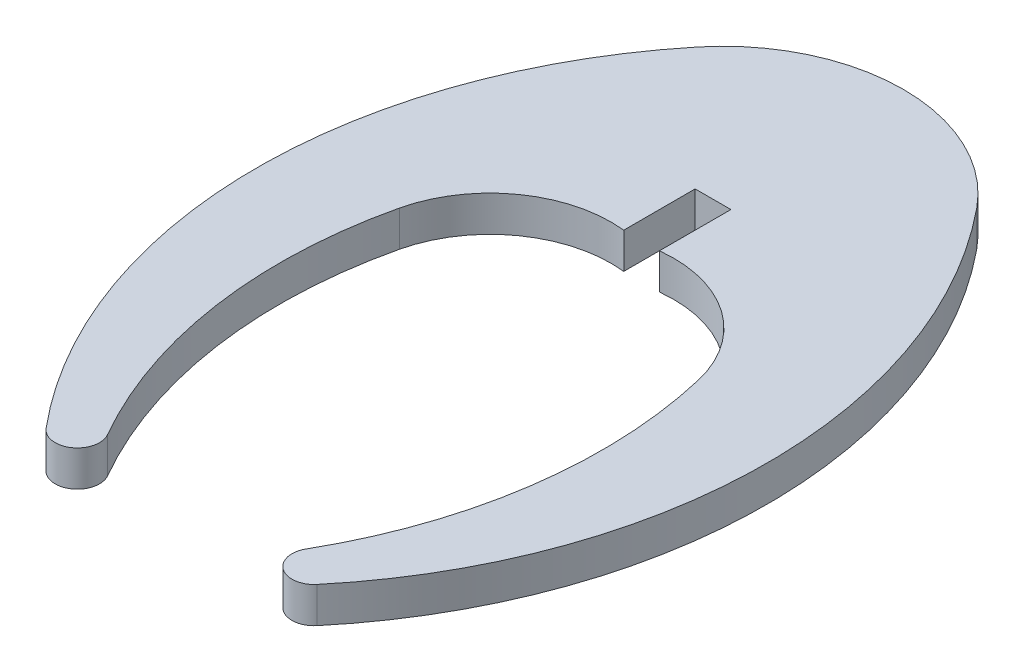
ISO-10303-21;
HEADER;
FILE_DESCRIPTION(('STEP AP214'),'2;1');
FILE_NAME('part.step','',(''),(''),'','','');
FILE_SCHEMA(('AUTOMOTIVE_DESIGN { 1 0 10303 214 1 1 1 1 }'));
ENDSEC;
DATA;
#1=APPLICATION_CONTEXT('core data for automotive mechanical design processes');
#2=APPLICATION_PROTOCOL_DEFINITION('international standard','automotive_design',2000,#1);
#3=PRODUCT_CONTEXT('',#1,'mechanical');
#4=PRODUCT('Part','Part','',(#3));
#5=PRODUCT_RELATED_PRODUCT_CATEGORY('part','',(#4));
#6=PRODUCT_DEFINITION_FORMATION('','',#4);
#7=PRODUCT_DEFINITION_CONTEXT('part definition',#1,'design');
#8=PRODUCT_DEFINITION('design','',#6,#7);
#9=PRODUCT_DEFINITION_SHAPE('','',#8);
#10=(LENGTH_UNIT() NAMED_UNIT(*) SI_UNIT(.MILLI.,.METRE.));
#11=(NAMED_UNIT(*) PLANE_ANGLE_UNIT() SI_UNIT($,.RADIAN.));
#12=(NAMED_UNIT(*) SI_UNIT($,.STERADIAN.) SOLID_ANGLE_UNIT());
#13=UNCERTAINTY_MEASURE_WITH_UNIT(LENGTH_MEASURE(1.E-05),#10,'distance_accuracy_value','');
#14=(GEOMETRIC_REPRESENTATION_CONTEXT(3) GLOBAL_UNCERTAINTY_ASSIGNED_CONTEXT((#13)) GLOBAL_UNIT_ASSIGNED_CONTEXT((#10,
#11,#12)) REPRESENTATION_CONTEXT('',''));
#15=CARTESIAN_POINT('',(0.,0.,0.));
#16=DIRECTION('',(0.,0.,1.));
#17=DIRECTION('',(1.,0.,0.));
#18=AXIS2_PLACEMENT_3D('',#15,#16,#17);
#19=CARTESIAN_POINT('',(-42034.834036,3.,-18212.047257));
#20=DIRECTION('',(0.999999944159212,0.,0.000334187930379139));
#21=DIRECTION('',(0.000334187930379139,0.,-0.999999944159212));
#22=AXIS2_PLACEMENT_3D('',#19,#20,#21);
#23=PLANE('',#22);
#24=DIRECTION('',(-0.000334187930379139,0.,0.999999944159212));
#25=VECTOR('',#24,1.);
#26=CARTESIAN_POINT('',(-42034.834036,0.,-18212.047257));
#27=LINE('',#26,#25);
#28=CARTESIAN_POINT('',(-42034.832031,0.,-18218.046875));
#29=VERTEX_POINT('',#28);
#30=CARTESIAN_POINT('',(-42034.834036,0.,-18212.047257));
#31=VERTEX_POINT('',#30);
#32=EDGE_CURVE('E155',#29,#31,#27,.T.);
#33=ORIENTED_EDGE('',*,*,#32,.T.);
#34=DIRECTION('',(0.,-1.,0.));
#35=VECTOR('',#34,1.);
#36=CARTESIAN_POINT('',(-42034.834036,3.,-18212.047257));
#37=LINE('',#36,#35);
#38=CARTESIAN_POINT('',(-42034.834036,3.,-18212.047257));
#39=VERTEX_POINT('',#38);
#40=EDGE_CURVE('E11',#39,#31,#37,.T.);
#41=ORIENTED_EDGE('',*,*,#40,.F.);
#42=DIRECTION('',(-0.000334187930379139,0.,0.999999944159212));
#43=VECTOR('',#42,1.);
#44=CARTESIAN_POINT('',(-42034.834036,3.,-18212.047257));
#45=LINE('',#44,#43);
#46=CARTESIAN_POINT('',(-42034.832031,3.,-18218.046875));
#47=VERTEX_POINT('',#46);
#48=EDGE_CURVE('E177',#47,#39,#45,.T.);
#49=ORIENTED_EDGE('',*,*,#48,.F.);
#50=DIRECTION('',(0.,-1.,0.));
#51=VECTOR('',#50,1.);
#52=CARTESIAN_POINT('',(-42034.832031,3.,-18218.046875));
#53=LINE('',#52,#51);
#54=EDGE_CURVE('E151',#47,#29,#53,.T.);
#55=ORIENTED_EDGE('',*,*,#54,.T.);
#56=EDGE_LOOP('',(#33,#41,#49,#55));
#57=FACE_BOUND('',#56,.T.);
#58=ADVANCED_FACE('F35',(#57),#23,.F.);
#59=CARTESIAN_POINT('',(-42033.6927198403,3.,-18201.9454393074));
#60=DIRECTION('',(0.,-1.,0.));
#61=DIRECTION('',(0.,0.,-1.));
#62=AXIS2_PLACEMENT_3D('',#59,#60,#61);
#63=CYLINDRICAL_SURFACE('',#62,10.1660869202994);
#64=CARTESIAN_POINT('',(-42033.6927198403,0.,-18201.9454393074));
#65=DIRECTION('',(0.,-1.,0.));
#66=DIRECTION('',(0.,0.,1.));
#67=AXIS2_PLACEMENT_3D('',#64,#65,#66);
#68=CIRCLE('',#67,10.1660869202994);
#69=CARTESIAN_POINT('',(-42023.795611,0.,-18204.268489));
#70=VERTEX_POINT('',#69);
#71=EDGE_CURVE('E158',#31,#70,#68,.T.);
#72=ORIENTED_EDGE('',*,*,#71,.T.);
#73=DIRECTION('',(0.,-1.,0.));
#74=VECTOR('',#73,1.);
#75=CARTESIAN_POINT('',(-42023.795611,3.,-18204.268489));
#76=LINE('',#75,#74);
#77=CARTESIAN_POINT('',(-42023.795611,3.,-18204.268489));
#78=VERTEX_POINT('',#77);
#79=EDGE_CURVE('E43',#78,#70,#76,.T.);
#80=ORIENTED_EDGE('',*,*,#79,.F.);
#81=CARTESIAN_POINT('',(-42033.6927198403,3.,-18201.9454393074));
#82=DIRECTION('',(0.,-1.,0.));
#83=DIRECTION('',(0.,0.,1.));
#84=AXIS2_PLACEMENT_3D('',#81,#82,#83);
#85=CIRCLE('',#84,10.1660869202994);
#86=EDGE_CURVE('E106',#39,#78,#85,.T.);
#87=ORIENTED_EDGE('',*,*,#86,.F.);
#88=ORIENTED_EDGE('',*,*,#40,.T.);
#89=EDGE_LOOP('',(#72,#80,#87,#88));
#90=FACE_BOUND('',#89,.T.);
#91=ADVANCED_FACE('F255',(#90),#63,.F.);
#92=CARTESIAN_POINT('',(-42062.3390260011,3.,-18195.2184921067));
#93=DIRECTION('',(0.,-1.,0.));
#94=DIRECTION('',(0.,0.,-1.));
#95=AXIS2_PLACEMENT_3D('',#92,#93,#94);
#96=CYLINDRICAL_SURFACE('',#95,39.5916314858943);
#97=CARTESIAN_POINT('',(-42062.3390260011,0.,-18195.2184921067));
#98=DIRECTION('',(0.,-1.,0.));
#99=DIRECTION('',(0.,0.,1.));
#100=AXIS2_PLACEMENT_3D('',#97,#98,#99);
#101=CIRCLE('',#100,39.5916314858943);
#102=CARTESIAN_POINT('',(-42027.9935790001,0.,-18175.523631));
#103=VERTEX_POINT('',#102);
#104=EDGE_CURVE('E160',#70,#103,#101,.T.);
#105=ORIENTED_EDGE('',*,*,#104,.T.);
#106=DIRECTION('',(0.,-1.,0.));
#107=VECTOR('',#106,1.);
#108=CARTESIAN_POINT('',(-42027.9935790001,3.,-18175.523631));
#109=LINE('',#108,#107);
#110=CARTESIAN_POINT('',(-42027.9935790001,3.,-18175.523631));
#111=VERTEX_POINT('',#110);
#112=EDGE_CURVE('E196',#111,#103,#109,.T.);
#113=ORIENTED_EDGE('',*,*,#112,.F.);
#114=CARTESIAN_POINT('',(-42062.3390260011,3.,-18195.2184921067));
#115=DIRECTION('',(0.,-1.,0.));
#116=DIRECTION('',(0.,0.,1.));
#117=AXIS2_PLACEMENT_3D('',#114,#115,#116);
#118=CIRCLE('',#117,39.5916314858943);
#119=EDGE_CURVE('E204',#78,#111,#118,.T.);
#120=ORIENTED_EDGE('',*,*,#119,.F.);
#121=ORIENTED_EDGE('',*,*,#79,.T.);
#122=EDGE_LOOP('',(#105,#113,#120,#121));
#123=FACE_BOUND('',#122,.T.);
#124=ADVANCED_FACE('F202',(#123),#96,.F.);
#125=CARTESIAN_POINT('',(-42026.3807247337,3.,-18174.6028281178));
#126=DIRECTION('',(0.,-1.,0.));
#127=DIRECTION('',(0.,0.,-1.));
#128=AXIS2_PLACEMENT_3D('',#125,#126,#127);
#129=CYLINDRICAL_SURFACE('',#128,1.85719595960211);
#130=CARTESIAN_POINT('',(-42026.3807247337,0.,-18174.6028281178));
#131=DIRECTION('',(0.,1.,0.));
#132=DIRECTION('',(0.,0.,1.));
#133=AXIS2_PLACEMENT_3D('',#130,#131,#132);
#134=CIRCLE('',#133,1.85719595960211);
#135=CARTESIAN_POINT('',(-42024.957301,0.,-18173.4099149999));
#136=VERTEX_POINT('',#135);
#137=EDGE_CURVE('E162',#103,#136,#134,.T.);
#138=ORIENTED_EDGE('',*,*,#137,.T.);
#139=DIRECTION('',(0.,-1.,0.));
#140=VECTOR('',#139,1.);
#141=CARTESIAN_POINT('',(-42024.957301,3.,-18173.4099149999));
#142=LINE('',#141,#140);
#143=CARTESIAN_POINT('',(-42024.957301,3.,-18173.4099149999));
#144=VERTEX_POINT('',#143);
#145=EDGE_CURVE('E193',#144,#136,#142,.T.);
#146=ORIENTED_EDGE('',*,*,#145,.F.);
#147=CARTESIAN_POINT('',(-42026.3807247337,3.,-18174.6028281178));
#148=DIRECTION('',(0.,1.,0.));
#149=DIRECTION('',(0.,0.,1.));
#150=AXIS2_PLACEMENT_3D('',#147,#148,#149);
#151=CIRCLE('',#150,1.85719595960211);
#152=EDGE_CURVE('E222',#111,#144,#151,.T.);
#153=ORIENTED_EDGE('',*,*,#152,.F.);
#154=ORIENTED_EDGE('',*,*,#112,.T.);
#155=EDGE_LOOP('',(#138,#146,#153,#154));
#156=FACE_BOUND('',#155,.T.);
#157=ADVANCED_FACE('F213',(#156),#129,.T.);
#158=CARTESIAN_POINT('',(-42058.0976320179,3.,-18201.1444438065));
#159=DIRECTION('',(0.,-1.,0.));
#160=DIRECTION('',(0.,0.,-1.));
#161=AXIS2_PLACEMENT_3D('',#158,#159,#160);
#162=CYLINDRICAL_SURFACE('',#161,43.2144145870036);
#163=CARTESIAN_POINT('',(-42058.0976320179,0.,-18201.1444438065));
#164=DIRECTION('',(0.,1.,0.));
#165=DIRECTION('',(0.,0.,1.));
#166=AXIS2_PLACEMENT_3D('',#163,#164,#165);
#167=CIRCLE('',#166,43.2144145870036);
#168=CARTESIAN_POINT('',(-42024.611583,0.,-18228.460559));
#169=VERTEX_POINT('',#168);
#170=EDGE_CURVE('E164',#136,#169,#167,.T.);
#171=ORIENTED_EDGE('',*,*,#170,.T.);
#172=DIRECTION('',(0.,-1.,0.));
#173=VECTOR('',#172,1.);
#174=CARTESIAN_POINT('',(-42024.611583,3.,-18228.460559));
#175=LINE('',#174,#173);
#176=CARTESIAN_POINT('',(-42024.611583,3.,-18228.460559));
#177=VERTEX_POINT('',#176);
#178=EDGE_CURVE('E190',#177,#169,#175,.T.);
#179=ORIENTED_EDGE('',*,*,#178,.F.);
#180=CARTESIAN_POINT('',(-42058.0976320179,3.,-18201.1444438065));
#181=DIRECTION('',(0.,1.,0.));
#182=DIRECTION('',(0.,0.,1.));
#183=AXIS2_PLACEMENT_3D('',#180,#181,#182);
#184=CIRCLE('',#183,43.2144145870036);
#185=EDGE_CURVE('E219',#144,#177,#184,.T.);
#186=ORIENTED_EDGE('',*,*,#185,.F.);
#187=ORIENTED_EDGE('',*,*,#145,.T.);
#188=EDGE_LOOP('',(#171,#179,#186,#187));
#189=FACE_BOUND('',#188,.T.);
#190=ADVANCED_FACE('F217',(#189),#162,.T.);
#191=CARTESIAN_POINT('',(-42036.3337421351,3.,-18218.8945302069));
#192=DIRECTION('',(0.,-1.,0.));
#193=DIRECTION('',(0.,0.,-1.));
#194=AXIS2_PLACEMENT_3D('',#191,#192,#193);
#195=CYLINDRICAL_SURFACE('',#194,15.1300337627026);
#196=CARTESIAN_POINT('',(-42036.3337421351,0.,-18218.8945302069));
#197=DIRECTION('',(0.,1.,0.));
#198=DIRECTION('',(0.,0.,1.));
#199=AXIS2_PLACEMENT_3D('',#196,#197,#198);
#200=CIRCLE('',#199,15.1300337627026);
#201=CARTESIAN_POINT('',(-42048.064893,0.,-18228.44953));
#202=VERTEX_POINT('',#201);
#203=EDGE_CURVE('E166',#169,#202,#200,.T.);
#204=ORIENTED_EDGE('',*,*,#203,.T.);
#205=DIRECTION('',(0.,-1.,0.));
#206=VECTOR('',#205,1.);
#207=CARTESIAN_POINT('',(-42048.064893,3.,-18228.44953));
#208=LINE('',#207,#206);
#209=CARTESIAN_POINT('',(-42048.064893,3.,-18228.44953));
#210=VERTEX_POINT('',#209);
#211=EDGE_CURVE('E187',#210,#202,#208,.T.);
#212=ORIENTED_EDGE('',*,*,#211,.F.);
#213=CARTESIAN_POINT('',(-42036.3337421351,3.,-18218.8945302069));
#214=DIRECTION('',(0.,1.,0.));
#215=DIRECTION('',(0.,0.,1.));
#216=AXIS2_PLACEMENT_3D('',#213,#214,#215);
#217=CIRCLE('',#216,15.1300337627026);
#218=EDGE_CURVE('E221',#177,#210,#217,.T.);
#219=ORIENTED_EDGE('',*,*,#218,.F.);
#220=ORIENTED_EDGE('',*,*,#178,.T.);
#221=EDGE_LOOP('',(#204,#212,#219,#220));
#222=FACE_BOUND('',#221,.T.);
#223=ADVANCED_FACE('F268',(#222),#195,.T.);
#224=CARTESIAN_POINT('',(-42014.5585744342,3.,-18201.1593485656));
#225=DIRECTION('',(0.,-1.,0.));
#226=DIRECTION('',(0.,0.,-1.));
#227=AXIS2_PLACEMENT_3D('',#224,#225,#226);
#228=CYLINDRICAL_SURFACE('',#227,43.2137407145987);
#229=CARTESIAN_POINT('',(-42014.5585744342,0.,-18201.1593485656));
#230=DIRECTION('',(0.,1.,0.));
#231=DIRECTION('',(0.,0.,1.));
#232=AXIS2_PLACEMENT_3D('',#229,#230,#231);
#233=CIRCLE('',#232,43.2137407145987);
#234=CARTESIAN_POINT('',(-42047.6746850001,0.,-18173.3969530001));
#235=VERTEX_POINT('',#234);
#236=EDGE_CURVE('E168',#202,#235,#233,.T.);
#237=ORIENTED_EDGE('',*,*,#236,.T.);
#238=DIRECTION('',(0.,-1.,0.));
#239=VECTOR('',#238,1.);
#240=CARTESIAN_POINT('',(-42047.6746850001,3.,-18173.3969530001));
#241=LINE('',#240,#239);
#242=CARTESIAN_POINT('',(-42047.6746850001,3.,-18173.3969530001));
#243=VERTEX_POINT('',#242);
#244=EDGE_CURVE('E184',#243,#235,#241,.T.);
#245=ORIENTED_EDGE('',*,*,#244,.F.);
#246=CARTESIAN_POINT('',(-42014.5585744342,3.,-18201.1593485656));
#247=DIRECTION('',(0.,1.,0.));
#248=DIRECTION('',(0.,0.,1.));
#249=AXIS2_PLACEMENT_3D('',#246,#247,#248);
#250=CIRCLE('',#249,43.2137407145987);
#251=EDGE_CURVE('E224',#210,#243,#250,.T.);
#252=ORIENTED_EDGE('',*,*,#251,.F.);
#253=ORIENTED_EDGE('',*,*,#211,.T.);
#254=EDGE_LOOP('',(#237,#245,#252,#253));
#255=FACE_BOUND('',#254,.T.);
#256=ADVANCED_FACE('F271',(#255),#228,.T.);
#257=CARTESIAN_POINT('',(-42046.2492862944,3.,-18174.5922949324));
#258=DIRECTION('',(0.,-1.,0.));
#259=DIRECTION('',(0.,0.,-1.));
#260=AXIS2_PLACEMENT_3D('',#257,#258,#259);
#261=CYLINDRICAL_SURFACE('',#260,1.86026982058769);
#262=CARTESIAN_POINT('',(-42046.2492862944,0.,-18174.5922949324));
#263=DIRECTION('',(0.,1.,0.));
#264=DIRECTION('',(0.,0.,1.));
#265=AXIS2_PLACEMENT_3D('',#262,#263,#264);
#266=CIRCLE('',#265,1.86026982058769);
#267=CARTESIAN_POINT('',(-42044.635357,0.,-18175.517409));
#268=VERTEX_POINT('',#267);
#269=EDGE_CURVE('E170',#235,#268,#266,.T.);
#270=ORIENTED_EDGE('',*,*,#269,.T.);
#271=DIRECTION('',(0.,-1.,0.));
#272=VECTOR('',#271,1.);
#273=CARTESIAN_POINT('',(-42044.635357,3.,-18175.517409));
#274=LINE('',#273,#272);
#275=CARTESIAN_POINT('',(-42044.635357,3.,-18175.517409));
#276=VERTEX_POINT('',#275);
#277=EDGE_CURVE('E181',#276,#268,#274,.T.);
#278=ORIENTED_EDGE('',*,*,#277,.F.);
#279=CARTESIAN_POINT('',(-42046.2492862944,3.,-18174.5922949324));
#280=DIRECTION('',(0.,1.,0.));
#281=DIRECTION('',(0.,0.,1.));
#282=AXIS2_PLACEMENT_3D('',#279,#280,#281);
#283=CIRCLE('',#282,1.86026982058769);
#284=EDGE_CURVE('E230',#243,#276,#283,.T.);
#285=ORIENTED_EDGE('',*,*,#284,.F.);
#286=ORIENTED_EDGE('',*,*,#244,.T.);
#287=EDGE_LOOP('',(#270,#278,#285,#286));
#288=FACE_BOUND('',#287,.T.);
#289=ADVANCED_FACE('F236',(#288),#261,.T.);
#290=CARTESIAN_POINT('',(-42010.3038584924,3.,-18195.2365428488));
#291=DIRECTION('',(0.,-1.,0.));
#292=DIRECTION('',(0.,0.,-1.));
#293=AXIS2_PLACEMENT_3D('',#290,#291,#292);
#294=CYLINDRICAL_SURFACE('',#293,39.5916156468009);
#295=CARTESIAN_POINT('',(-42010.3038584924,0.,-18195.2365428488));
#296=DIRECTION('',(0.,-1.,0.));
#297=DIRECTION('',(0.,0.,1.));
#298=AXIS2_PLACEMENT_3D('',#295,#296,#297);
#299=CIRCLE('',#298,39.5916156468009);
#300=CARTESIAN_POINT('',(-42048.854104,0.,-18204.25733));
#301=VERTEX_POINT('',#300);
#302=EDGE_CURVE('E172',#268,#301,#299,.T.);
#303=ORIENTED_EDGE('',*,*,#302,.T.);
#304=DIRECTION('',(0.,-1.,0.));
#305=VECTOR('',#304,1.);
#306=CARTESIAN_POINT('',(-42048.854104,3.,-18204.25733));
#307=LINE('',#306,#305);
#308=CARTESIAN_POINT('',(-42048.854104,3.,-18204.25733));
#309=VERTEX_POINT('',#308);
#310=EDGE_CURVE('E146',#309,#301,#307,.T.);
#311=ORIENTED_EDGE('',*,*,#310,.F.);
#312=CARTESIAN_POINT('',(-42010.3038584924,3.,-18195.2365428488));
#313=DIRECTION('',(0.,-1.,0.));
#314=DIRECTION('',(0.,0.,1.));
#315=AXIS2_PLACEMENT_3D('',#312,#313,#314);
#316=CIRCLE('',#315,39.5916156468009);
#317=EDGE_CURVE('E137',#276,#309,#316,.T.);
#318=ORIENTED_EDGE('',*,*,#317,.F.);
#319=ORIENTED_EDGE('',*,*,#277,.T.);
#320=EDGE_LOOP('',(#303,#311,#318,#319));
#321=FACE_BOUND('',#320,.T.);
#322=ADVANCED_FACE('F240',(#321),#294,.F.);
#323=CARTESIAN_POINT('',(-42038.954622847,3.,-18201.945061322));
#324=DIRECTION('',(0.,-1.,0.));
#325=DIRECTION('',(0.,0.,-1.));
#326=AXIS2_PLACEMENT_3D('',#323,#324,#325);
#327=CYLINDRICAL_SURFACE('',#326,10.1659388910991);
#328=CARTESIAN_POINT('',(-42038.954622847,0.,-18201.945061322));
#329=DIRECTION('',(0.,-1.,0.));
#330=DIRECTION('',(0.,0.,1.));
#331=AXIS2_PLACEMENT_3D('',#328,#329,#330);
#332=CIRCLE('',#331,10.1659388910991);
#333=CARTESIAN_POINT('',(-42037.832031,0.,-18212.048828));
#334=VERTEX_POINT('',#333);
#335=EDGE_CURVE('E145',#301,#334,#332,.T.);
#336=ORIENTED_EDGE('',*,*,#335,.T.);
#337=DIRECTION('',(0.,-1.,0.));
#338=VECTOR('',#337,1.);
#339=CARTESIAN_POINT('',(-42037.832031,3.,-18212.048828));
#340=LINE('',#339,#338);
#341=CARTESIAN_POINT('',(-42037.832031,3.,-18212.048828));
#342=VERTEX_POINT('',#341);
#343=EDGE_CURVE('E142',#342,#334,#340,.T.);
#344=ORIENTED_EDGE('',*,*,#343,.F.);
#345=CARTESIAN_POINT('',(-42038.954622847,3.,-18201.945061322));
#346=DIRECTION('',(0.,-1.,0.));
#347=DIRECTION('',(0.,0.,1.));
#348=AXIS2_PLACEMENT_3D('',#345,#346,#347);
#349=CIRCLE('',#348,10.1659388910991);
#350=EDGE_CURVE('E131',#309,#342,#349,.T.);
#351=ORIENTED_EDGE('',*,*,#350,.F.);
#352=ORIENTED_EDGE('',*,*,#310,.T.);
#353=EDGE_LOOP('',(#336,#344,#351,#352));
#354=FACE_BOUND('',#353,.T.);
#355=ADVANCED_FACE('F143',(#354),#327,.F.);
#356=CARTESIAN_POINT('',(-42037.835937,3.,-18218.044922));
#357=DIRECTION('',(-0.999999787823403,0.,0.000651423939430844));
#358=DIRECTION('',(0.000651423939430844,0.,0.999999787823403));
#359=AXIS2_PLACEMENT_3D('',#356,#357,#358);
#360=PLANE('',#359);
#361=DIRECTION('',(-0.000651423939430844,0.,-0.999999787823403));
#362=VECTOR('',#361,1.);
#363=CARTESIAN_POINT('',(-42037.835937,0.,-18218.044922));
#364=LINE('',#363,#362);
#365=CARTESIAN_POINT('',(-42037.835937,0.,-18218.044922));
#366=VERTEX_POINT('',#365);
#367=EDGE_CURVE('E92',#334,#366,#364,.T.);
#368=ORIENTED_EDGE('',*,*,#367,.T.);
#369=DIRECTION('',(0.,-1.,0.));
#370=VECTOR('',#369,1.);
#371=CARTESIAN_POINT('',(-42037.835937,3.,-18218.044922));
#372=LINE('',#371,#370);
#373=CARTESIAN_POINT('',(-42037.835937,3.,-18218.044922));
#374=VERTEX_POINT('',#373);
#375=EDGE_CURVE('E147',#374,#366,#372,.T.);
#376=ORIENTED_EDGE('',*,*,#375,.F.);
#377=DIRECTION('',(-0.000651423939430844,0.,-0.999999787823403));
#378=VECTOR('',#377,1.);
#379=CARTESIAN_POINT('',(-42037.835937,3.,-18218.044922));
#380=LINE('',#379,#378);
#381=EDGE_CURVE('E135',#342,#374,#380,.T.);
#382=ORIENTED_EDGE('',*,*,#381,.F.);
#383=ORIENTED_EDGE('',*,*,#343,.T.);
#384=EDGE_LOOP('',(#368,#376,#382,#383));
#385=FACE_BOUND('',#384,.T.);
#386=ADVANCED_FACE('F149',(#385),#360,.F.);
#387=CARTESIAN_POINT('',(-42034.832031,3.,-18218.046875));
#388=DIRECTION('',(-0.000650153362122118,0.,-0.999999788650281));
#389=DIRECTION('',(-0.999999788650281,0.,0.000650153362122118));
#390=AXIS2_PLACEMENT_3D('',#387,#388,#389);
#391=PLANE('',#390);
#392=DIRECTION('',(0.99999978865028,0.,-0.000650153362122118));
#393=VECTOR('',#392,1.);
#394=CARTESIAN_POINT('',(-42034.832031,0.,-18218.046875));
#395=LINE('',#394,#393);
#396=EDGE_CURVE('E98',#366,#29,#395,.T.);
#397=ORIENTED_EDGE('',*,*,#396,.T.);
#398=ORIENTED_EDGE('',*,*,#54,.F.);
#399=DIRECTION('',(0.99999978865028,0.,-0.000650153362122118));
#400=VECTOR('',#399,1.);
#401=CARTESIAN_POINT('',(-42034.832031,3.,-18218.046875));
#402=LINE('',#401,#400);
#403=EDGE_CURVE('E51',#374,#47,#402,.T.);
#404=ORIENTED_EDGE('',*,*,#403,.F.);
#405=ORIENTED_EDGE('',*,*,#375,.T.);
#406=EDGE_LOOP('',(#397,#398,#404,#405));
#407=FACE_BOUND('',#406,.T.);
#408=ADVANCED_FACE('F244',(#407),#391,.F.);
#409=CARTESIAN_POINT('',(-42038.954622847,3.,-18201.945061322));
#410=DIRECTION('',(0.,1.,0.));
#411=DIRECTION('',(0.,0.,1.));
#412=AXIS2_PLACEMENT_3D('',#409,#410,#411);
#413=PLANE('',#412);
#414=ORIENTED_EDGE('',*,*,#48,.T.);
#415=ORIENTED_EDGE('',*,*,#86,.T.);
#416=ORIENTED_EDGE('',*,*,#119,.T.);
#417=ORIENTED_EDGE('',*,*,#152,.T.);
#418=ORIENTED_EDGE('',*,*,#185,.T.);
#419=ORIENTED_EDGE('',*,*,#218,.T.);
#420=ORIENTED_EDGE('',*,*,#251,.T.);
#421=ORIENTED_EDGE('',*,*,#284,.T.);
#422=ORIENTED_EDGE('',*,*,#317,.T.);
#423=ORIENTED_EDGE('',*,*,#350,.T.);
#424=ORIENTED_EDGE('',*,*,#381,.T.);
#425=ORIENTED_EDGE('',*,*,#403,.T.);
#426=EDGE_LOOP('',(#414,#415,#416,#417,#418,#419,#420,#421,#422,#423,#424,#425));
#427=FACE_BOUND('',#426,.T.);
#428=ADVANCED_FACE('F133',(#427),#413,.T.);
#429=CARTESIAN_POINT('',(-42038.954622847,0.,-18201.945061322));
#430=DIRECTION('',(0.,1.,0.));
#431=DIRECTION('',(0.,0.,1.));
#432=AXIS2_PLACEMENT_3D('',#429,#430,#431);
#433=PLANE('',#432);
#434=ORIENTED_EDGE('',*,*,#32,.F.);
#435=ORIENTED_EDGE('',*,*,#396,.F.);
#436=ORIENTED_EDGE('',*,*,#367,.F.);
#437=ORIENTED_EDGE('',*,*,#335,.F.);
#438=ORIENTED_EDGE('',*,*,#302,.F.);
#439=ORIENTED_EDGE('',*,*,#269,.F.);
#440=ORIENTED_EDGE('',*,*,#236,.F.);
#441=ORIENTED_EDGE('',*,*,#203,.F.);
#442=ORIENTED_EDGE('',*,*,#170,.F.);
#443=ORIENTED_EDGE('',*,*,#137,.F.);
#444=ORIENTED_EDGE('',*,*,#104,.F.);
#445=ORIENTED_EDGE('',*,*,#71,.F.);
#446=EDGE_LOOP('',(#434,#435,#436,#437,#438,#439,#440,#441,#442,#443,#444,#445));
#447=FACE_BOUND('',#446,.T.);
#448=ADVANCED_FACE('F208',(#447),#433,.F.);
#449=CLOSED_SHELL('',(#58,#91,#124,#157,#190,#223,#256,#289,#322,#355,#386,#408,#428,#448));
#450=MANIFOLD_SOLID_BREP('B2',#449);
#451=ADVANCED_BREP_SHAPE_REPRESENTATION('',(#18,#450),#14);
#452=SHAPE_DEFINITION_REPRESENTATION(#9,#451);
ENDSEC;
END-ISO-10303-21;
